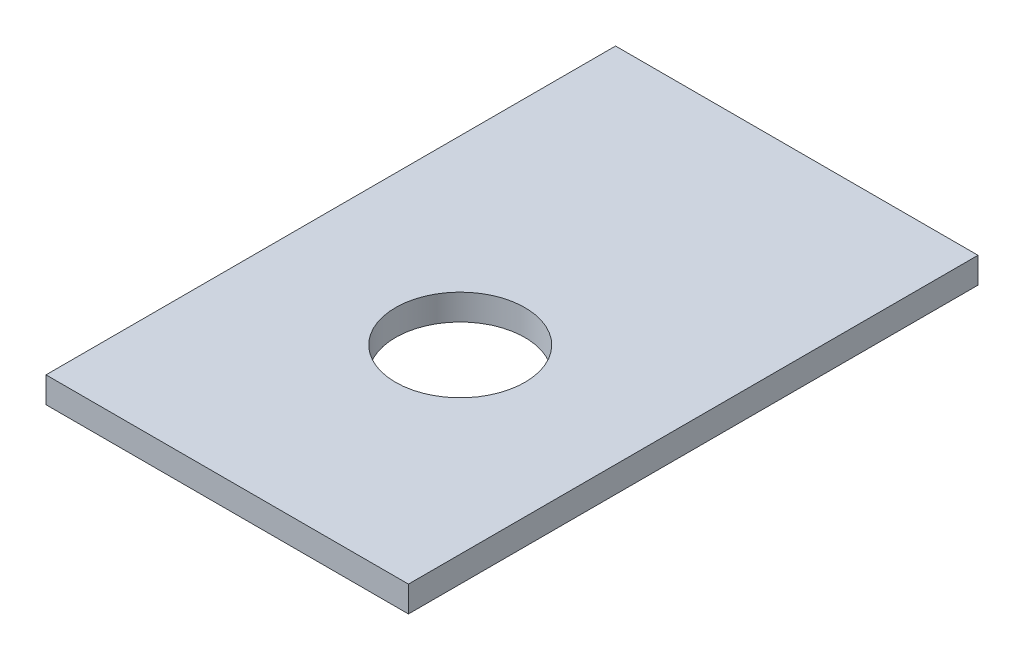
ISO-10303-21;
HEADER;
FILE_DESCRIPTION(('STEP AP214'),'2;1');
FILE_NAME('part.step','',(''),(''),'','','');
FILE_SCHEMA(('AUTOMOTIVE_DESIGN { 1 0 10303 214 1 1 1 1 }'));
ENDSEC;
DATA;
#1=APPLICATION_CONTEXT('core data for automotive mechanical design processes');
#2=APPLICATION_PROTOCOL_DEFINITION('international standard','automotive_design',2000,#1);
#3=PRODUCT_CONTEXT('',#1,'mechanical');
#4=PRODUCT('Part','Part','',(#3));
#5=PRODUCT_RELATED_PRODUCT_CATEGORY('part','',(#4));
#6=PRODUCT_DEFINITION_FORMATION('','',#4);
#7=PRODUCT_DEFINITION_CONTEXT('part definition',#1,'design');
#8=PRODUCT_DEFINITION('design','',#6,#7);
#9=PRODUCT_DEFINITION_SHAPE('','',#8);
#10=(LENGTH_UNIT() NAMED_UNIT(*) SI_UNIT(.MILLI.,.METRE.));
#11=(NAMED_UNIT(*) PLANE_ANGLE_UNIT() SI_UNIT($,.RADIAN.));
#12=(NAMED_UNIT(*) SI_UNIT($,.STERADIAN.) SOLID_ANGLE_UNIT());
#13=UNCERTAINTY_MEASURE_WITH_UNIT(LENGTH_MEASURE(1.E-05),#10,'distance_accuracy_value','');
#14=(GEOMETRIC_REPRESENTATION_CONTEXT(3) GLOBAL_UNCERTAINTY_ASSIGNED_CONTEXT((#13)) GLOBAL_UNIT_ASSIGNED_CONTEXT((#10,
#11,#12)) REPRESENTATION_CONTEXT('',''));
#15=CARTESIAN_POINT('',(0.,0.,0.));
#16=DIRECTION('',(0.,0.,1.));
#17=DIRECTION('',(1.,0.,0.));
#18=AXIS2_PLACEMENT_3D('',#15,#16,#17);
#19=CARTESIAN_POINT('',(0.,5.,0.));
#20=DIRECTION('',(0.,1.,0.));
#21=DIRECTION('',(0.,0.,1.));
#22=AXIS2_PLACEMENT_3D('',#19,#20,#21);
#23=PLANE('',#22);
#24=DIRECTION('',(0.,0.,1.));
#25=VECTOR('',#24,1.);
#26=CARTESIAN_POINT('',(-29.203821656051,5.,-18.8375796178344));
#27=LINE('',#26,#25);
#28=CARTESIAN_POINT('',(-29.203821656051,5.,-18.8375796178344));
#29=VERTEX_POINT('',#28);
#30=CARTESIAN_POINT('',(-29.2038216560509,5.,91.1624203821656));
#31=VERTEX_POINT('',#30);
#32=EDGE_CURVE('E86',#29,#31,#27,.T.);
#33=ORIENTED_EDGE('',*,*,#32,.T.);
#34=DIRECTION('',(1.,0.,0.));
#35=VECTOR('',#34,1.);
#36=CARTESIAN_POINT('',(-29.2038216560509,5.,91.1624203821656));
#37=LINE('',#36,#35);
#38=CARTESIAN_POINT('',(40.7961783439491,5.,91.1624203821656));
#39=VERTEX_POINT('',#38);
#40=EDGE_CURVE('E81',#31,#39,#37,.T.);
#41=ORIENTED_EDGE('',*,*,#40,.T.);
#42=DIRECTION('',(0.,0.,-1.));
#43=VECTOR('',#42,1.);
#44=CARTESIAN_POINT('',(40.796178343949,5.,-18.8375796178344));
#45=LINE('',#44,#43);
#46=CARTESIAN_POINT('',(40.796178343949,5.,-18.8375796178344));
#47=VERTEX_POINT('',#46);
#48=EDGE_CURVE('E84',#39,#47,#45,.T.);
#49=ORIENTED_EDGE('',*,*,#48,.T.);
#50=DIRECTION('',(-1.,0.,0.));
#51=VECTOR('',#50,1.);
#52=CARTESIAN_POINT('',(-29.203821656051,5.,-18.8375796178344));
#53=LINE('',#52,#51);
#54=EDGE_CURVE('E51',#47,#29,#53,.T.);
#55=ORIENTED_EDGE('',*,*,#54,.T.);
#56=EDGE_LOOP('',(#33,#41,#49,#55));
#57=FACE_BOUND('',#56,.T.);
#58=CARTESIAN_POINT('',(5.79617834394905,5.,46.1624203821656));
#59=DIRECTION('',(0.,1.,0.));
#60=DIRECTION('',(0.,0.,1.));
#61=AXIS2_PLACEMENT_3D('',#58,#59,#60);
#62=CIRCLE('',#61,12.5);
#63=CARTESIAN_POINT('',(5.79617834394905,5.,58.6624203821656));
#64=VERTEX_POINT('',#63);
#65=EDGE_CURVE('E101',#64,#64,#62,.T.);
#66=ORIENTED_EDGE('',*,*,#65,.F.);
#67=EDGE_LOOP('',(#66));
#68=FACE_BOUND('',#67,.T.);
#69=ADVANCED_FACE('F34',(#57,#68),#23,.T.);
#70=CARTESIAN_POINT('',(0.,0.,0.));
#71=DIRECTION('',(0.,1.,0.));
#72=DIRECTION('',(0.,0.,1.));
#73=AXIS2_PLACEMENT_3D('',#70,#71,#72);
#74=PLANE('',#73);
#75=DIRECTION('',(0.,0.,1.));
#76=VECTOR('',#75,1.);
#77=CARTESIAN_POINT('',(-29.203821656051,0.,-18.8375796178344));
#78=LINE('',#77,#76);
#79=CARTESIAN_POINT('',(-29.203821656051,0.,-18.8375796178344));
#80=VERTEX_POINT('',#79);
#81=CARTESIAN_POINT('',(-29.2038216560509,0.,91.1624203821656));
#82=VERTEX_POINT('',#81);
#83=EDGE_CURVE('E98',#80,#82,#78,.T.);
#84=ORIENTED_EDGE('',*,*,#83,.F.);
#85=DIRECTION('',(-1.,0.,0.));
#86=VECTOR('',#85,1.);
#87=CARTESIAN_POINT('',(-29.203821656051,0.,-18.8375796178344));
#88=LINE('',#87,#86);
#89=CARTESIAN_POINT('',(40.796178343949,0.,-18.8375796178344));
#90=VERTEX_POINT('',#89);
#91=EDGE_CURVE('E74',#90,#80,#88,.T.);
#92=ORIENTED_EDGE('',*,*,#91,.F.);
#93=DIRECTION('',(0.,0.,-1.));
#94=VECTOR('',#93,1.);
#95=CARTESIAN_POINT('',(40.796178343949,0.,-18.8375796178344));
#96=LINE('',#95,#94);
#97=CARTESIAN_POINT('',(40.7961783439491,0.,91.1624203821656));
#98=VERTEX_POINT('',#97);
#99=EDGE_CURVE('E68',#98,#90,#96,.T.);
#100=ORIENTED_EDGE('',*,*,#99,.F.);
#101=DIRECTION('',(1.,0.,0.));
#102=VECTOR('',#101,1.);
#103=CARTESIAN_POINT('',(-29.2038216560509,0.,91.1624203821656));
#104=LINE('',#103,#102);
#105=EDGE_CURVE('E90',#82,#98,#104,.T.);
#106=ORIENTED_EDGE('',*,*,#105,.F.);
#107=EDGE_LOOP('',(#84,#92,#100,#106));
#108=FACE_BOUND('',#107,.T.);
#109=CARTESIAN_POINT('',(5.79617834394905,0.,46.1624203821656));
#110=DIRECTION('',(0.,1.,0.));
#111=DIRECTION('',(0.,0.,1.));
#112=AXIS2_PLACEMENT_3D('',#109,#110,#111);
#113=CIRCLE('',#112,12.5);
#114=CARTESIAN_POINT('',(5.79617834394905,0.,58.6624203821656));
#115=VERTEX_POINT('',#114);
#116=EDGE_CURVE('E113',#115,#115,#113,.T.);
#117=ORIENTED_EDGE('',*,*,#116,.T.);
#118=EDGE_LOOP('',(#117));
#119=FACE_BOUND('',#118,.T.);
#120=ADVANCED_FACE('F109',(#108,#119),#74,.F.);
#121=CARTESIAN_POINT('',(-29.203821656051,5.,-18.8375796178344));
#122=DIRECTION('',(1.,0.,0.));
#123=DIRECTION('',(0.,0.,-1.));
#124=AXIS2_PLACEMENT_3D('',#121,#122,#123);
#125=PLANE('',#124);
#126=ORIENTED_EDGE('',*,*,#83,.T.);
#127=DIRECTION('',(0.,-1.,0.));
#128=VECTOR('',#127,1.);
#129=CARTESIAN_POINT('',(-29.2038216560509,5.,91.1624203821656));
#130=LINE('',#129,#128);
#131=EDGE_CURVE('E11',#31,#82,#130,.T.);
#132=ORIENTED_EDGE('',*,*,#131,.F.);
#133=ORIENTED_EDGE('',*,*,#32,.F.);
#134=DIRECTION('',(0.,-1.,0.));
#135=VECTOR('',#134,1.);
#136=CARTESIAN_POINT('',(-29.203821656051,5.,-18.8375796178344));
#137=LINE('',#136,#135);
#138=EDGE_CURVE('E94',#29,#80,#137,.T.);
#139=ORIENTED_EDGE('',*,*,#138,.T.);
#140=EDGE_LOOP('',(#126,#132,#133,#139));
#141=FACE_BOUND('',#140,.T.);
#142=ADVANCED_FACE('F36',(#141),#125,.F.);
#143=CARTESIAN_POINT('',(-29.2038216560509,5.,91.1624203821656));
#144=DIRECTION('',(0.,0.,-1.));
#145=DIRECTION('',(-1.,0.,0.));
#146=AXIS2_PLACEMENT_3D('',#143,#144,#145);
#147=PLANE('',#146);
#148=ORIENTED_EDGE('',*,*,#105,.T.);
#149=DIRECTION('',(0.,-1.,0.));
#150=VECTOR('',#149,1.);
#151=CARTESIAN_POINT('',(40.7961783439491,5.,91.1624203821656));
#152=LINE('',#151,#150);
#153=EDGE_CURVE('E43',#39,#98,#152,.T.);
#154=ORIENTED_EDGE('',*,*,#153,.F.);
#155=ORIENTED_EDGE('',*,*,#40,.F.);
#156=ORIENTED_EDGE('',*,*,#131,.T.);
#157=EDGE_LOOP('',(#148,#154,#155,#156));
#158=FACE_BOUND('',#157,.T.);
#159=ADVANCED_FACE('F89',(#158),#147,.F.);
#160=CARTESIAN_POINT('',(40.796178343949,5.,-18.8375796178344));
#161=DIRECTION('',(-1.,0.,0.));
#162=DIRECTION('',(0.,0.,1.));
#163=AXIS2_PLACEMENT_3D('',#160,#161,#162);
#164=PLANE('',#163);
#165=ORIENTED_EDGE('',*,*,#99,.T.);
#166=DIRECTION('',(0.,-1.,0.));
#167=VECTOR('',#166,1.);
#168=CARTESIAN_POINT('',(40.796178343949,5.,-18.8375796178344));
#169=LINE('',#168,#167);
#170=EDGE_CURVE('E91',#47,#90,#169,.T.);
#171=ORIENTED_EDGE('',*,*,#170,.F.);
#172=ORIENTED_EDGE('',*,*,#48,.F.);
#173=ORIENTED_EDGE('',*,*,#153,.T.);
#174=EDGE_LOOP('',(#165,#171,#172,#173));
#175=FACE_BOUND('',#174,.T.);
#176=ADVANCED_FACE('F92',(#175),#164,.F.);
#177=CARTESIAN_POINT('',(-29.203821656051,5.,-18.8375796178344));
#178=DIRECTION('',(0.,0.,1.));
#179=DIRECTION('',(1.,0.,0.));
#180=AXIS2_PLACEMENT_3D('',#177,#178,#179);
#181=PLANE('',#180);
#182=ORIENTED_EDGE('',*,*,#91,.T.);
#183=ORIENTED_EDGE('',*,*,#138,.F.);
#184=ORIENTED_EDGE('',*,*,#54,.F.);
#185=ORIENTED_EDGE('',*,*,#170,.T.);
#186=EDGE_LOOP('',(#182,#183,#184,#185));
#187=FACE_BOUND('',#186,.T.);
#188=ADVANCED_FACE('F106',(#187),#181,.F.);
#189=CARTESIAN_POINT('',(5.79617834394905,5.,46.1624203821656));
#190=DIRECTION('',(0.,-1.,0.));
#191=DIRECTION('',(0.,0.,-1.));
#192=AXIS2_PLACEMENT_3D('',#189,#190,#191);
#193=CYLINDRICAL_SURFACE('',#192,12.5);
#194=ORIENTED_EDGE('',*,*,#65,.T.);
#195=EDGE_LOOP('',(#194));
#196=FACE_BOUND('',#195,.T.);
#197=ORIENTED_EDGE('',*,*,#116,.F.);
#198=EDGE_LOOP('',(#197));
#199=FACE_BOUND('',#198,.T.);
#200=ADVANCED_FACE('F119',(#196,#199),#193,.F.);
#201=CLOSED_SHELL('',(#69,#120,#142,#159,#176,#188,#200));
#202=MANIFOLD_SOLID_BREP('B2',#201);
#203=ADVANCED_BREP_SHAPE_REPRESENTATION('',(#18,#202),#14);
#204=SHAPE_DEFINITION_REPRESENTATION(#9,#203);
ENDSEC;
END-ISO-10303-21;
